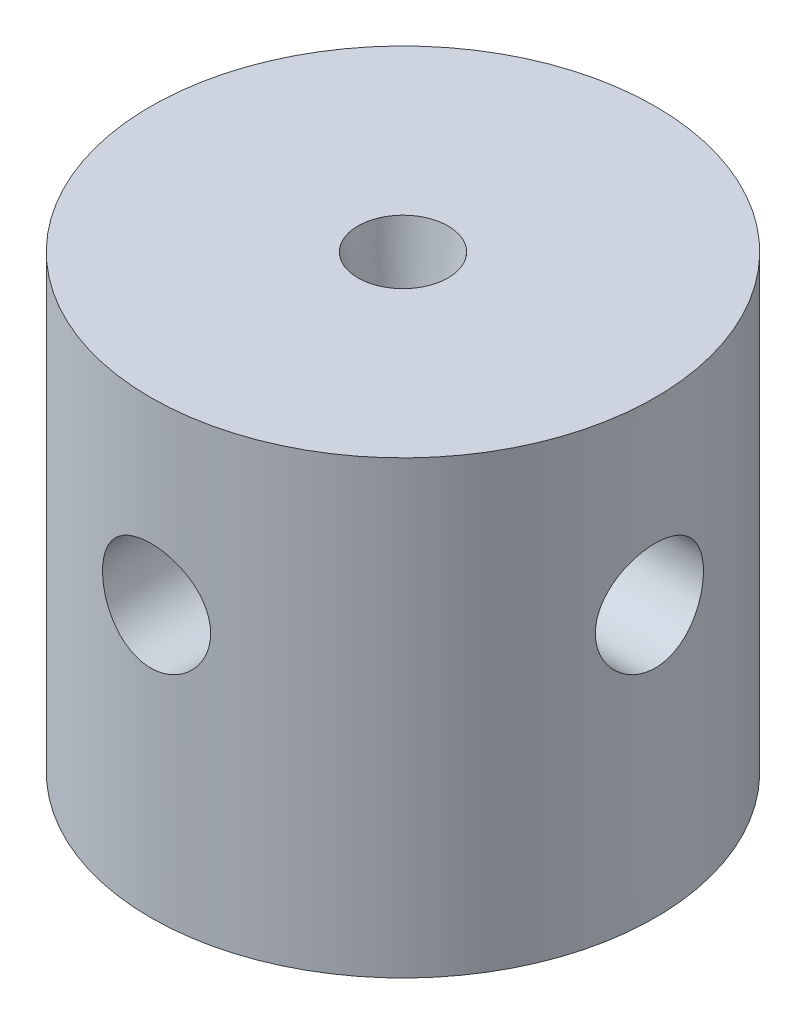
ISO-10303-21;
HEADER;
FILE_DESCRIPTION(('STEP AP214'),'2;1');
FILE_NAME('part.step','',(''),(''),'','','');
FILE_SCHEMA(('AUTOMOTIVE_DESIGN { 1 0 10303 214 1 1 1 1 }'));
ENDSEC;
DATA;
#1=APPLICATION_CONTEXT('core data for automotive mechanical design processes');
#2=APPLICATION_PROTOCOL_DEFINITION('international standard','automotive_design',2000,#1);
#3=PRODUCT_CONTEXT('',#1,'mechanical');
#4=PRODUCT('Part','Part','',(#3));
#5=PRODUCT_RELATED_PRODUCT_CATEGORY('part','',(#4));
#6=PRODUCT_DEFINITION_FORMATION('','',#4);
#7=PRODUCT_DEFINITION_CONTEXT('part definition',#1,'design');
#8=PRODUCT_DEFINITION('design','',#6,#7);
#9=PRODUCT_DEFINITION_SHAPE('','',#8);
#10=(LENGTH_UNIT() NAMED_UNIT(*) SI_UNIT(.MILLI.,.METRE.));
#11=(NAMED_UNIT(*) PLANE_ANGLE_UNIT() SI_UNIT($,.RADIAN.));
#12=(NAMED_UNIT(*) SI_UNIT($,.STERADIAN.) SOLID_ANGLE_UNIT());
#13=UNCERTAINTY_MEASURE_WITH_UNIT(LENGTH_MEASURE(1.E-05),#10,'distance_accuracy_value','');
#14=(GEOMETRIC_REPRESENTATION_CONTEXT(3) GLOBAL_UNCERTAINTY_ASSIGNED_CONTEXT((#13)) GLOBAL_UNIT_ASSIGNED_CONTEXT((#10,
#11,#12)) REPRESENTATION_CONTEXT('',''));
#15=CARTESIAN_POINT('',(0.,0.,0.));
#16=DIRECTION('',(0.,0.,1.));
#17=DIRECTION('',(1.,0.,0.));
#18=AXIS2_PLACEMENT_3D('',#15,#16,#17);
#19=CARTESIAN_POINT('',(0.,7.26763268611322,0.));
#20=DIRECTION('',(0.,1.,0.));
#21=DIRECTION('',(0.,0.,1.));
#22=AXIS2_PLACEMENT_3D('',#19,#20,#21);
#23=CONICAL_SURFACE('',#22,1.5,0.13962634015954);
#24=CARTESIAN_POINT('',(0.,14.3830024084978,0.));
#25=DIRECTION('',(0.,1.,0.));
#26=DIRECTION('',(0.,0.,1.));
#27=AXIS2_PLACEMENT_3D('',#24,#25,#26);
#28=CIRCLE('',#27,2.5);
#29=CARTESIAN_POINT('',(0.,14.3830024084978,2.5));
#30=VERTEX_POINT('',#29);
#31=EDGE_CURVE('E89',#30,#30,#28,.T.);
#32=ORIENTED_EDGE('',*,*,#31,.T.);
#33=EDGE_LOOP('',(#32));
#34=FACE_BOUND('',#33,.T.);
#35=CARTESIAN_POINT('',(0.,7.26763268611322,0.));
#36=DIRECTION('',(0.,1.,0.));
#37=DIRECTION('',(0.,0.,1.));
#38=AXIS2_PLACEMENT_3D('',#35,#36,#37);
#39=CIRCLE('',#38,1.5);
#40=CARTESIAN_POINT('',(0.,7.26763268611322,1.5));
#41=VERTEX_POINT('',#40);
#42=EDGE_CURVE('E101',#41,#41,#39,.T.);
#43=ORIENTED_EDGE('',*,*,#42,.F.);
#44=EDGE_LOOP('',(#43));
#45=FACE_BOUND('',#44,.T.);
#46=ADVANCED_FACE('F31',(#34,#45),#23,.F.);
#47=CARTESIAN_POINT('',(-2.5,14.3830024084978,0.));
#48=DIRECTION('',(0.,1.,0.));
#49=DIRECTION('',(0.,0.,1.));
#50=AXIS2_PLACEMENT_3D('',#47,#48,#49);
#51=PLANE('',#50);
#52=CARTESIAN_POINT('',(0.,14.3830024084978,0.));
#53=DIRECTION('',(0.,1.,0.));
#54=DIRECTION('',(0.,0.,1.));
#55=AXIS2_PLACEMENT_3D('',#52,#53,#54);
#56=CIRCLE('',#55,14.);
#57=CARTESIAN_POINT('',(0.,14.3830024084978,14.));
#58=VERTEX_POINT('',#57);
#59=EDGE_CURVE('E92',#58,#58,#56,.T.);
#60=ORIENTED_EDGE('',*,*,#59,.T.);
#61=EDGE_LOOP('',(#60));
#62=FACE_BOUND('',#61,.T.);
#63=ORIENTED_EDGE('',*,*,#31,.F.);
#64=EDGE_LOOP('',(#63));
#65=FACE_BOUND('',#64,.T.);
#66=ADVANCED_FACE('F129',(#62,#65),#51,.T.);
#67=CARTESIAN_POINT('',(0.,20.798274686081,0.));
#68=DIRECTION('',(0.,1.,0.));
#69=DIRECTION('',(0.,0.,1.));
#70=AXIS2_PLACEMENT_3D('',#67,#68,#69);
#71=CYLINDRICAL_SURFACE('',#70,14.);
#72=CARTESIAN_POINT('',(-3.00000000000005,4.38300240849778,-13.6747943311773));
#73=CARTESIAN_POINT('',(-2.99999416477358,4.54942471346381,-13.6747976912119));
#74=CARTESIAN_POINT('',(-2.98610472489575,4.71591795638259,-13.6778654468474));
#75=CARTESIAN_POINT('',(-2.9309711850597,5.04417575298122,-13.6897835685885));
#76=CARTESIAN_POINT('',(-2.88970679307239,5.20593670585004,-13.6986382242345));
#77=CARTESIAN_POINT('',(-2.78117727369212,5.51993390764634,-13.7210823058705));
#78=CARTESIAN_POINT('',(-2.71394001982636,5.67218016474076,-13.7346666545171));
#79=CARTESIAN_POINT('',(-2.55545235346684,5.96323295638696,-13.7650334169722));
#80=CARTESIAN_POINT('',(-2.46420264097556,6.10203988255592,-13.7818157375507));
#81=CARTESIAN_POINT('',(-2.25870285140447,6.36452833146204,-13.8169915759332));
#82=CARTESIAN_POINT('',(-2.14413718967971,6.48796016097771,-13.8354049974351));
#83=CARTESIAN_POINT('',(-1.8959390162592,6.71400951730935,-13.8715938342079));
#84=CARTESIAN_POINT('',(-1.7623050604354,6.81662546621792,-13.8893692010283));
#85=CARTESIAN_POINT('',(-1.47809457692921,6.99911329748065,-13.9224953821886));
#86=CARTESIAN_POINT('',(-1.32736097645995,7.07874572003902,-13.9378199763886));
#87=CARTESIAN_POINT('',(-1.01426853868524,7.21145779139036,-13.9640934208587));
#88=CARTESIAN_POINT('',(-0.851910954760672,7.26454029807034,-13.9750427420666));
#89=CARTESIAN_POINT('',(-0.522774375343072,7.34186235036046,-13.9911913056236));
#90=CARTESIAN_POINT('',(-0.356098801193895,7.36652426560264,-13.9964746675677));
#91=CARTESIAN_POINT('',(-0.0208978906133376,7.3876249631243,-14.00098724414));
#92=CARTESIAN_POINT('',(0.14762724032947,7.38406684961929,-14.000217124654));
#93=CARTESIAN_POINT('',(0.478834058500975,7.34914447917062,-13.9927740172512));
#94=CARTESIAN_POINT('',(0.641566230724176,7.31823540791794,-13.9861976630486));
#95=CARTESIAN_POINT('',(0.959478927956729,7.23021304479406,-13.9679908317821));
#96=CARTESIAN_POINT('',(1.11465912035006,7.1730985998983,-13.9563601323304));
#97=CARTESIAN_POINT('',(1.41433499511306,7.03387949072074,-13.9291950929372));
#98=CARTESIAN_POINT('',(1.55874731403153,6.95160087408909,-13.9136337160789));
#99=CARTESIAN_POINT('',(1.83188185312564,6.76451847217059,-13.8803158748773));
#100=CARTESIAN_POINT('',(1.96060201290301,6.65971173389718,-13.8625591228939));
#101=CARTESIAN_POINT('',(2.20140417600391,6.42806531944205,-13.8263865292185));
#102=CARTESIAN_POINT('',(2.31310234640496,6.30082724978371,-13.8079646074571));
#103=CARTESIAN_POINT('',(2.51364486469451,6.02923583836077,-13.7728713366395));
#104=CARTESIAN_POINT('',(2.60248864236132,5.88488206968729,-13.7562000312677));
#105=CARTESIAN_POINT('',(2.75496155146588,5.58255340637026,-13.7264804717345));
#106=CARTESIAN_POINT('',(2.81852070177841,5.4245421607929,-13.7134423025555));
#107=CARTESIAN_POINT('',(2.91806990318226,5.0997368766049,-13.6926068161323));
#108=CARTESIAN_POINT('',(2.95406413389251,4.9329441736114,-13.6848087043697));
#109=CARTESIAN_POINT('',(2.99687172049299,4.59881090319835,-13.6754976251089));
#110=CARTESIAN_POINT('',(3.00424283857276,4.43154505834317,-13.673864541034));
#111=CARTESIAN_POINT('',(2.99110279284742,4.09817442213439,-13.6767447914799));
#112=CARTESIAN_POINT('',(2.97059346163266,3.93206955519068,-13.6812577220213));
#113=CARTESIAN_POINT('',(2.90275789271164,3.60766153853626,-13.6958083096841));
#114=CARTESIAN_POINT('',(2.85573660503102,3.44929154330387,-13.7057831054873));
#115=CARTESIAN_POINT('',(2.73654105893494,3.14267773343194,-13.7300771973956));
#116=CARTESIAN_POINT('',(2.66436447325632,2.9944348572294,-13.744396895457));
#117=CARTESIAN_POINT('',(2.49567008833405,2.70986303897995,-13.7760326816069));
#118=CARTESIAN_POINT('',(2.3988073718158,2.57374324447341,-13.7933900349263));
#119=CARTESIAN_POINT('',(2.18394367667196,2.31948571675019,-13.8290355072028));
#120=CARTESIAN_POINT('',(2.06594018364317,2.20135012560085,-13.8473237366892));
#121=CARTESIAN_POINT('',(1.80962552884158,1.98426180260827,-13.8831647998035));
#122=CARTESIAN_POINT('',(1.67098985165749,1.88568857618376,-13.9006987121549));
#123=CARTESIAN_POINT('',(1.3788029625645,1.71323158979568,-13.932712214298));
#124=CARTESIAN_POINT('',(1.22525243208743,1.63934670255212,-13.9471919435339));
#125=CARTESIAN_POINT('',(0.908530837964032,1.51889829922083,-13.9713855676315));
#126=CARTESIAN_POINT('',(0.745426386150298,1.47216580100522,-13.9811288760739));
#127=CARTESIAN_POINT('',(0.413450354006528,1.40681899703315,-13.9948787860397));
#128=CARTESIAN_POINT('',(0.24457957994793,1.38820077654997,-13.9988861862461));
#129=CARTESIAN_POINT('',(-0.0905274341056987,1.37978110367405,-14.000690220181));
#130=CARTESIAN_POINT('',(-0.256749011018478,1.38941209128849,-13.9986091800327));
#131=CARTESIAN_POINT('',(-0.585145876831997,1.43595193553589,-13.9887310472683));
#132=CARTESIAN_POINT('',(-0.747321232810724,1.47286033965461,-13.9809340494761));
#133=CARTESIAN_POINT('',(-1.06260389697448,1.57264002099658,-13.9605077727683));
#134=CARTESIAN_POINT('',(-1.21573673014601,1.63543378726821,-13.9478929286009));
#135=CARTESIAN_POINT('',(-1.50936991344688,1.78512495083671,-13.9191807210221));
#136=CARTESIAN_POINT('',(-1.6498690895938,1.87202458511239,-13.9030830344402));
#137=CARTESIAN_POINT('',(-1.91702461378904,2.06932704598053,-13.8687961986559));
#138=CARTESIAN_POINT('',(-2.04338073020598,2.18013072513062,-13.8505741780296));
#139=CARTESIAN_POINT('',(-2.27590002915852,2.42128362900827,-13.8142738016446));
#140=CARTESIAN_POINT('',(-2.38205836126947,2.55163753524556,-13.7961954813912));
#141=CARTESIAN_POINT('',(-2.57246523191566,2.83018339483703,-13.761973872554));
#142=CARTESIAN_POINT('',(-2.65641795611849,2.97858112494323,-13.7458581173137));
#143=CARTESIAN_POINT('',(-2.79806009312276,3.28768985021461,-13.7177299427786));
#144=CARTESIAN_POINT('',(-2.85577212846065,3.44839009896963,-13.7057139912142));
#145=CARTESIAN_POINT('',(-2.93277214244346,3.73825467089013,-13.6894112131582));
#146=CARTESIAN_POINT('',(-2.95793505015823,3.865825759919,-13.683965661845));
#147=CARTESIAN_POINT('',(-2.99155088086548,4.12325103164685,-13.6766559900021));
#148=CARTESIAN_POINT('',(-3.00000455455868,4.25310511151276,-13.6747917085757));
#149=CARTESIAN_POINT('',(-3.00000000000005,4.38300240849778,-13.6747943311773));
#150=B_SPLINE_CURVE_WITH_KNOTS('',3,(#72,#73,#74,#75,#76,#77,#78,#79,#80,#81,#82,#83,#84,#85,
#86,#87,#88,#89,#90,#91,#92,#93,#94,#95,#96,#97,#98,#99,#100,#101,#102,#103,#104,#105,#106,#107,
#108,#109,#110,#111,#112,#113,#114,#115,#116,#117,#118,#119,#120,#121,#122,#123,#124,#125,#126,
#127,#128,#129,#130,#131,#132,#133,#134,#135,#136,#137,#138,#139,#140,#141,#142,#143,#144,#145,
#146,#147,#148,#149),.UNSPECIFIED.,.T.,.F.,(4,2,2,2,2,2,2,2,2,2,2,2,2,2,2,2,2,2,2,2,2,2,2,2,2,2,
2,2,2,2,2,2,2,2,2,2,2,2,4),(0.,0.498790964055055,0.997952076959928,1.49657898230552,
1.99519135347057,2.50106459165384,3.00697616225757,3.51798269640557,4.02893421292535,
4.53219016303857,5.03539075554482,5.53037115334743,6.02537333215167,6.52387776286874,
7.0224475774463,7.5309792155859,8.03952354046184,8.54946574823562,9.05933061907677,
9.55920866385045,10.0590538530783,10.5532636149875,11.047519111263,11.5491002043264,
12.0507409931816,12.5613242936642,13.0718842775108,13.5792317964875,14.0865086641708,
14.5836639928825,15.080811074302,15.5764801923897,16.0721953230273,16.5769782832193,
17.0818823126246,17.593207603363,18.1040912322742,18.4934291224859,18.8827495204009),.UNSPECIFIED.);
#151=CARTESIAN_POINT('',(-3.00000000000005,4.38300240849778,-13.6747943311773));
#152=VERTEX_POINT('',#151);
#153=EDGE_CURVE('E10',#152,#152,#150,.T.);
#154=ORIENTED_EDGE('',*,*,#153,.F.);
#155=EDGE_LOOP('',(#154));
#156=FACE_BOUND('',#155,.T.);
#157=CARTESIAN_POINT('',(-13.6747943311773,4.38300240849778,3.));
#158=CARTESIAN_POINT('',(-13.6747976912119,4.54942471346381,2.99999416477353));
#159=CARTESIAN_POINT('',(-13.6778654468474,4.71591795638259,2.9861047248957));
#160=CARTESIAN_POINT('',(-13.6897835685885,5.04417575298122,2.93097118505965));
#161=CARTESIAN_POINT('',(-13.6986382242345,5.20593670585004,2.88970679307235));
#162=CARTESIAN_POINT('',(-13.7210823058705,5.51993390764634,2.78117727369208));
#163=CARTESIAN_POINT('',(-13.7346666545171,5.67218016474076,2.71394001982631));
#164=CARTESIAN_POINT('',(-13.7650334169723,5.96323295638696,2.55545235346679));
#165=CARTESIAN_POINT('',(-13.7818157375507,6.10203988255592,2.46420264097551));
#166=CARTESIAN_POINT('',(-13.8169915759333,6.36452833146204,2.25870285140442));
#167=CARTESIAN_POINT('',(-13.8354049974351,6.48796016097771,2.14413718967966));
#168=CARTESIAN_POINT('',(-13.8715938342079,6.71400951730935,1.89593901625915));
#169=CARTESIAN_POINT('',(-13.8893692010283,6.81662546621792,1.76230506043535));
#170=CARTESIAN_POINT('',(-13.9224953821887,6.99911329748065,1.47809457692916));
#171=CARTESIAN_POINT('',(-13.9378199763886,7.07874572003902,1.32736097645991));
#172=CARTESIAN_POINT('',(-13.9640934208587,7.21145779139036,1.01426853868519));
#173=CARTESIAN_POINT('',(-13.9750427420666,7.26454029807034,0.851910954760624));
#174=CARTESIAN_POINT('',(-13.9911913056236,7.34186235036046,0.522774375343024));
#175=CARTESIAN_POINT('',(-13.9964746675677,7.36652426560264,0.356098801193847));
#176=CARTESIAN_POINT('',(-14.00098724414,7.3876249631243,0.0208978906132897));
#177=CARTESIAN_POINT('',(-14.000217124654,7.38406684961929,-0.147627240329518));
#178=CARTESIAN_POINT('',(-13.9927740172512,7.34914447917062,-0.478834058501023));
#179=CARTESIAN_POINT('',(-13.9861976630486,7.31823540791794,-0.641566230724225));
#180=CARTESIAN_POINT('',(-13.9679908317821,7.23021304479406,-0.959478927956778));
#181=CARTESIAN_POINT('',(-13.9563601323304,7.1730985998983,-1.11465912035011));
#182=CARTESIAN_POINT('',(-13.9291950929372,7.03387949072074,-1.41433499511311));
#183=CARTESIAN_POINT('',(-13.9136337160789,6.95160087408909,-1.55874731403158));
#184=CARTESIAN_POINT('',(-13.8803158748773,6.76451847217059,-1.83188185312569));
#185=CARTESIAN_POINT('',(-13.8625591228939,6.65971173389718,-1.96060201290306));
#186=CARTESIAN_POINT('',(-13.8263865292185,6.42806531944205,-2.20140417600396));
#187=CARTESIAN_POINT('',(-13.8079646074571,6.30082724978371,-2.31310234640501));
#188=CARTESIAN_POINT('',(-13.7728713366395,6.02923583836077,-2.51364486469456));
#189=CARTESIAN_POINT('',(-13.7562000312677,5.88488206968728,-2.60248864236137));
#190=CARTESIAN_POINT('',(-13.7264804717345,5.58255340637026,-2.75496155146593));
#191=CARTESIAN_POINT('',(-13.7134423025555,5.4245421607929,-2.81852070177845));
#192=CARTESIAN_POINT('',(-13.6926068161323,5.0997368766049,-2.91806990318231));
#193=CARTESIAN_POINT('',(-13.6848087043697,4.9329441736114,-2.95406413389256));
#194=CARTESIAN_POINT('',(-13.6754976251089,4.59881090319835,-2.99687172049304));
#195=CARTESIAN_POINT('',(-13.673864541034,4.43154505834317,-3.0042428385728));
#196=CARTESIAN_POINT('',(-13.6767447914799,4.09817442213439,-2.99110279284747));
#197=CARTESIAN_POINT('',(-13.6812577220213,3.93206955519068,-2.9705934616327));
#198=CARTESIAN_POINT('',(-13.6958083096841,3.60766153853626,-2.90275789271168));
#199=CARTESIAN_POINT('',(-13.7057831054873,3.44929154330387,-2.85573660503107));
#200=CARTESIAN_POINT('',(-13.7300771973955,3.14267773343194,-2.73654105893499));
#201=CARTESIAN_POINT('',(-13.744396895457,2.9944348572294,-2.66436447325637));
#202=CARTESIAN_POINT('',(-13.7760326816069,2.70986303897995,-2.4956700883341));
#203=CARTESIAN_POINT('',(-13.7933900349263,2.57374324447341,-2.39880737181584));
#204=CARTESIAN_POINT('',(-13.8290355072028,2.31948571675019,-2.18394367667201));
#205=CARTESIAN_POINT('',(-13.8473237366892,2.20135012560085,-2.06594018364322));
#206=CARTESIAN_POINT('',(-13.8831647998035,1.98426180260827,-1.80962552884163));
#207=CARTESIAN_POINT('',(-13.9006987121549,1.88568857618376,-1.67098985165754));
#208=CARTESIAN_POINT('',(-13.932712214298,1.71323158979568,-1.37880296256455));
#209=CARTESIAN_POINT('',(-13.9471919435339,1.63934670255212,-1.22525243208748));
#210=CARTESIAN_POINT('',(-13.9713855676315,1.51889829922083,-0.908530837964081));
#211=CARTESIAN_POINT('',(-13.9811288760739,1.47216580100522,-0.745426386150348));
#212=CARTESIAN_POINT('',(-13.9948787860397,1.40681899703315,-0.413450354006578));
#213=CARTESIAN_POINT('',(-13.9988861862461,1.38820077654997,-0.24457957994798));
#214=CARTESIAN_POINT('',(-14.000690220181,1.37978110367405,0.0905274341056491));
#215=CARTESIAN_POINT('',(-13.9986091800327,1.38941209128849,0.256749011018429));
#216=CARTESIAN_POINT('',(-13.9887310472683,1.43595193553589,0.585145876831948));
#217=CARTESIAN_POINT('',(-13.9809340494761,1.47286033965461,0.747321232810675));
#218=CARTESIAN_POINT('',(-13.9605077727683,1.57264002099658,1.06260389697443));
#219=CARTESIAN_POINT('',(-13.9478929286009,1.63543378726821,1.21573673014596));
#220=CARTESIAN_POINT('',(-13.9191807210222,1.78512495083671,1.50936991344683));
#221=CARTESIAN_POINT('',(-13.9030830344402,1.87202458511239,1.64986908959375));
#222=CARTESIAN_POINT('',(-13.8687961986559,2.06932704598053,1.91702461378899));
#223=CARTESIAN_POINT('',(-13.8505741780296,2.18013072513062,2.04338073020593));
#224=CARTESIAN_POINT('',(-13.8142738016446,2.42128362900827,2.27590002915847));
#225=CARTESIAN_POINT('',(-13.7961954813913,2.55163753524556,2.38205836126942));
#226=CARTESIAN_POINT('',(-13.761973872554,2.83018339483703,2.57246523191562));
#227=CARTESIAN_POINT('',(-13.7458581173137,2.97858112494323,2.65641795611844));
#228=CARTESIAN_POINT('',(-13.7177299427787,3.28768985021461,2.79806009312271));
#229=CARTESIAN_POINT('',(-13.7057139912142,3.44839009896963,2.8557721284606));
#230=CARTESIAN_POINT('',(-13.6894112131582,3.73825467089013,2.93277214244341));
#231=CARTESIAN_POINT('',(-13.683965661845,3.865825759919,2.95793505015818));
#232=CARTESIAN_POINT('',(-13.6766559900021,4.12325103164685,2.99155088086543));
#233=CARTESIAN_POINT('',(-13.6747917085757,4.25310511151276,3.00000455455863));
#234=CARTESIAN_POINT('',(-13.6747943311773,4.38300240849778,3.));
#235=B_SPLINE_CURVE_WITH_KNOTS('',3,(#157,#158,#159,#160,#161,#162,#163,#164,#165,#166,#167,
#168,#169,#170,#171,#172,#173,#174,#175,#176,#177,#178,#179,#180,#181,#182,#183,#184,#185,#186,
#187,#188,#189,#190,#191,#192,#193,#194,#195,#196,#197,#198,#199,#200,#201,#202,#203,#204,#205,
#206,#207,#208,#209,#210,#211,#212,#213,#214,#215,#216,#217,#218,#219,#220,#221,#222,#223,#224,
#225,#226,#227,#228,#229,#230,#231,#232,#233,#234),.UNSPECIFIED.,.T.,.F.,(4,2,2,2,2,2,2,2,2,2,2,
2,2,2,2,2,2,2,2,2,2,2,2,2,2,2,2,2,2,2,2,2,2,2,2,2,2,2,4),(0.,0.498790964055055,
0.997952076959928,1.49657898230552,1.99519135347057,2.50106459165384,3.00697616225757,
3.51798269640556,4.02893421292535,4.53219016303857,5.03539075554482,5.53037115334743,
6.02537333215167,6.52387776286874,7.0224475774463,7.5309792155859,8.03952354046184,
8.54946574823562,9.05933061907677,9.55920866385045,10.0590538530783,10.5532636149875,
11.047519111263,11.5491002043264,12.0507409931816,12.5613242936642,13.0718842775108,
13.5792317964875,14.0865086641708,14.5836639928825,15.080811074302,15.5764801923897,
16.0721953230273,16.5769782832193,17.0818823126246,17.593207603363,18.1040912322742,
18.4934291224859,18.8827495204009),.UNSPECIFIED.);
#236=CARTESIAN_POINT('',(-13.6747943311773,4.38300240849778,3.));
#237=VERTEX_POINT('',#236);
#238=EDGE_CURVE('E41',#237,#237,#235,.T.);
#239=ORIENTED_EDGE('',*,*,#238,.F.);
#240=EDGE_LOOP('',(#239));
#241=FACE_BOUND('',#240,.T.);
#242=CARTESIAN_POINT('',(0.,1.38300240849778,14.));
#243=CARTESIAN_POINT('',(0.166471772181233,1.38300820764638,13.9999969208645));
#244=CARTESIAN_POINT('',(0.333014391200549,1.39690562527348,13.9970005189942));
#245=CARTESIAN_POINT('',(0.661374688586657,1.45207372220493,13.9853365965546));
#246=CARTESIAN_POINT('',(0.823188807142384,1.49336449688761,13.976664912742));
#247=CARTESIAN_POINT('',(1.13729864763548,1.6019711377138,13.9546166357765));
#248=CARTESIAN_POINT('',(1.28960392689312,1.66926036726036,13.9412448593434));
#249=CARTESIAN_POINT('',(1.58075635592159,1.82787058084023,13.9112421363594));
#250=CARTESIAN_POINT('',(1.71960396349476,1.91919074699758,13.8946113007332));
#251=CARTESIAN_POINT('',(1.98204958107049,2.1247630078447,13.8596273849262));
#252=CARTESIAN_POINT('',(2.10541006838894,2.23931485229473,13.8412536628652));
#253=CARTESIAN_POINT('',(2.33132084778875,2.48745503986806,13.8050013962829));
#254=CARTESIAN_POINT('',(2.43386934301822,2.62104502500017,13.7871228946326));
#255=CARTESIAN_POINT('',(2.61628408759624,2.90521391421851,13.7536823209445));
#256=CARTESIAN_POINT('',(2.69589916670025,3.05595744401006,13.7381467268872));
#257=CARTESIAN_POINT('',(2.82857647382304,3.36907131603131,13.7114465111707));
#258=CARTESIAN_POINT('',(2.88164174003441,3.53144032548278,13.7002813894142));
#259=CARTESIAN_POINT('',(2.95893148844921,3.86062458167378,13.6837961785262));
#260=CARTESIAN_POINT('',(2.98357559496697,4.02733695982536,13.6783911379297));
#261=CARTESIAN_POINT('',(3.00462790413168,4.36261087351162,13.6737827969021));
#262=CARTESIAN_POINT('',(3.00103943329274,4.53117218885752,13.6745787658345));
#263=CARTESIAN_POINT('',(2.96606652681739,4.86225178436522,13.6822055320766));
#264=CARTESIAN_POINT('',(2.93516797298834,5.02482418669794,13.6889308336432));
#265=CARTESIAN_POINT('',(2.84722108597373,5.34242288907632,13.7074918675157));
#266=CARTESIAN_POINT('',(2.79017133872951,5.49744878056228,13.719327876168));
#267=CARTESIAN_POINT('',(2.65109102152004,5.79692815424433,13.7468816151144));
#268=CARTESIAN_POINT('',(2.56887221945682,5.94129143392276,13.7626284196673));
#269=CARTESIAN_POINT('',(2.3819201456801,6.21435273841358,13.7962114500257));
#270=CARTESIAN_POINT('',(2.27718392207149,6.34304870587007,13.8140479496379));
#271=CARTESIAN_POINT('',(2.04559085510666,6.58392111984447,13.8502543678775));
#272=CARTESIAN_POINT('',(1.91832046792908,6.69569982166716,13.8686276794435));
#273=CARTESIAN_POINT('',(1.64663461253847,6.89638987587702,13.9035003499412));
#274=CARTESIAN_POINT('',(1.50221885755108,6.98530084569848,13.9199996775194));
#275=CARTESIAN_POINT('',(1.19986692410021,7.13782376831158,13.94931557068));
#276=CARTESIAN_POINT('',(1.04190451772726,7.2013852336537,13.9621247728671));
#277=CARTESIAN_POINT('',(0.717206293371708,7.30095370513992,13.9825621849067));
#278=CARTESIAN_POINT('',(0.550471702267635,7.33696455362439,13.9901911172077));
#279=CARTESIAN_POINT('',(0.216375341673557,7.37983483678462,13.9993061269562));
#280=CARTESIAN_POINT('',(0.0490863545435281,7.38723783426134,14.0009067304213));
#281=CARTESIAN_POINT('',(-0.284337947300512,7.37415326624747,13.9981049787194));
#282=CARTESIAN_POINT('',(-0.450473336254215,7.35366751257192,13.993703013514));
#283=CARTESIAN_POINT('',(-0.77508507596532,7.28583792117442,13.9794628609053));
#284=CARTESIAN_POINT('',(-0.933623425816666,7.23877766955276,13.9696821009092));
#285=CARTESIAN_POINT('',(-1.24055690094655,7.1194485225082,13.9457784884302));
#286=CARTESIAN_POINT('',(-1.3889511851752,7.04717753987454,13.9316552764448));
#287=CARTESIAN_POINT('',(-1.67364279592924,6.87833532237721,13.900350087808));
#288=CARTESIAN_POINT('',(-1.80974515022202,6.78144281867842,13.8831286270855));
#289=CARTESIAN_POINT('',(-2.06395385104694,6.56653275872041,13.847620660697));
#290=CARTESIAN_POINT('',(-2.18205795738374,6.44851257672301,13.829334022842));
#291=CARTESIAN_POINT('',(-2.39905422115955,6.19220766812363,13.7933634541265));
#292=CARTESIAN_POINT('',(-2.4975707451029,6.0536022100537,13.7756958444257));
#293=CARTESIAN_POINT('',(-2.66992830772059,5.76149321554193,13.7433330911937));
#294=CARTESIAN_POINT('',(-2.74377039827391,5.60799031454294,13.7286378209611));
#295=CARTESIAN_POINT('',(-2.86419482497076,5.29125781050872,13.7040201961479));
#296=CARTESIAN_POINT('',(-2.91092797282532,5.1280876956366,13.6940714916594));
#297=CARTESIAN_POINT('',(-2.97625392170654,4.79597124083066,13.6800237341684));
#298=CARTESIAN_POINT('',(-2.994851015605,4.6270257860953,13.6759237887942));
#299=CARTESIAN_POINT('',(-3.00319999852067,4.29193772214745,13.6740923769631));
#300=CARTESIAN_POINT('',(-2.99354694516609,4.12581037853678,13.6762295303709));
#301=CARTESIAN_POINT('',(-2.9469957881265,3.79760792423276,13.6863352636966));
#302=CARTESIAN_POINT('',(-2.91009797915947,3.63553276972478,13.6943037805343));
#303=CARTESIAN_POINT('',(-2.81038691880858,3.32048509275959,13.7151116220832));
#304=CARTESIAN_POINT('',(-2.74765694341765,3.16748511116934,13.7279352844941));
#305=CARTESIAN_POINT('',(-2.59813503191194,2.87409166348421,13.757015291813));
#306=CARTESIAN_POINT('',(-2.51134070602993,2.73369945126782,13.7732719776073));
#307=CARTESIAN_POINT('',(-2.31416580698602,2.46656602104717,13.8077811118646));
#308=CARTESIAN_POINT('',(-2.20335974842469,2.34014301660394,13.8260661987785));
#309=CARTESIAN_POINT('',(-1.96217310923921,2.10748988345696,13.8623489959939));
#310=CARTESIAN_POINT('',(-1.83178801877117,2.00126441987347,13.8803466390259));
#311=CARTESIAN_POINT('',(-1.55320629453742,1.81077048948674,13.9142898209798));
#312=CARTESIAN_POINT('',(-1.40480969201927,1.7267891960359,13.9302072914125));
#313=CARTESIAN_POINT('',(-1.09570032188119,1.58509335068547,13.9579165220804));
#314=CARTESIAN_POINT('',(-0.93499821172776,1.52735636332776,13.9697118042469));
#315=CARTESIAN_POINT('',(-0.645070435106411,1.45029803823552,13.9856969692354));
#316=CARTESIAN_POINT('',(-0.517434411091962,1.42510954053775,13.9910278377653));
#317=CARTESIAN_POINT('',(-0.259879921707696,1.39145980507446,13.9981804830944));
#318=CARTESIAN_POINT('',(-0.129961550177492,1.38299788120567,14.0000024038263));
#319=CARTESIAN_POINT('',(0.,1.38300240849778,14.));
#320=B_SPLINE_CURVE_WITH_KNOTS('',3,(#242,#243,#244,#245,#246,#247,#248,#249,#250,#251,#252,
#253,#254,#255,#256,#257,#258,#259,#260,#261,#262,#263,#264,#265,#266,#267,#268,#269,#270,#271,
#272,#273,#274,#275,#276,#277,#278,#279,#280,#281,#282,#283,#284,#285,#286,#287,#288,#289,#290,
#291,#292,#293,#294,#295,#296,#297,#298,#299,#300,#301,#302,#303,#304,#305,#306,#307,#308,#309,
#310,#311,#312,#313,#314,#315,#316,#317,#318,#319),.UNSPECIFIED.,.T.,.F.,(4,2,2,2,2,2,2,2,2,2,2,
2,2,2,2,2,2,2,2,2,2,2,2,2,2,2,2,2,2,2,2,2,2,2,2,2,2,2,4),(0.,0.498939673024163,
0.998245766439869,1.4970416488512,1.99582055729177,2.50149923763463,3.00722155837012,
3.5182885842902,4.02929711354978,4.53266016249331,5.03596390338329,5.53048950905855,
6.02504185809136,6.52338712331935,7.02179775841778,7.53054022100581,8.03929119404699,
8.54905042279611,9.05873854512686,9.55869331408369,10.0586156046286,10.5533012117853,
11.0480277839687,11.549574677356,12.0511839460897,12.5616412656707,13.0720768215161,
13.5796448081695,14.0871353445837,14.5840136108059,15.0808865021654,15.5761699941357,
16.0715026890325,16.5764590030823,17.0815318079423,17.5928382071444,18.1037066802054,
18.4932359826459,18.8827493067467),.UNSPECIFIED.);
#321=CARTESIAN_POINT('',(0.,1.38300240849778,14.));
#322=VERTEX_POINT('',#321);
#323=EDGE_CURVE('E45',#322,#322,#320,.T.);
#324=ORIENTED_EDGE('',*,*,#323,.F.);
#325=EDGE_LOOP('',(#324));
#326=FACE_BOUND('',#325,.T.);
#327=CARTESIAN_POINT('',(13.6747943311773,4.38300240849778,-3.));
#328=CARTESIAN_POINT('',(13.6747976912119,4.54942471346381,-2.99999416477353));
#329=CARTESIAN_POINT('',(13.6778654468474,4.71591795638259,-2.9861047248957));
#330=CARTESIAN_POINT('',(13.6897835685885,5.04417575298122,-2.93097118505965));
#331=CARTESIAN_POINT('',(13.6986382242345,5.20593670585004,-2.88970679307235));
#332=CARTESIAN_POINT('',(13.7210823058705,5.51993390764634,-2.78117727369208));
#333=CARTESIAN_POINT('',(13.7346666545171,5.67218016474076,-2.71394001982631));
#334=CARTESIAN_POINT('',(13.7650334169723,5.96323295638696,-2.55545235346679));
#335=CARTESIAN_POINT('',(13.7818157375507,6.10203988255592,-2.46420264097551));
#336=CARTESIAN_POINT('',(13.8169915759333,6.36452833146204,-2.25870285140442));
#337=CARTESIAN_POINT('',(13.8354049974351,6.48796016097771,-2.14413718967966));
#338=CARTESIAN_POINT('',(13.8715938342079,6.71400951730935,-1.89593901625915));
#339=CARTESIAN_POINT('',(13.8893692010283,6.81662546621792,-1.76230506043535));
#340=CARTESIAN_POINT('',(13.9224953821887,6.99911329748065,-1.47809457692916));
#341=CARTESIAN_POINT('',(13.9378199763886,7.07874572003902,-1.32736097645991));
#342=CARTESIAN_POINT('',(13.9640934208587,7.21145779139036,-1.01426853868519));
#343=CARTESIAN_POINT('',(13.9750427420666,7.26454029807034,-0.851910954760624));
#344=CARTESIAN_POINT('',(13.9911913056236,7.34186235036046,-0.522774375343024));
#345=CARTESIAN_POINT('',(13.9964746675677,7.36652426560264,-0.356098801193847));
#346=CARTESIAN_POINT('',(14.00098724414,7.3876249631243,-0.0208978906132897));
#347=CARTESIAN_POINT('',(14.000217124654,7.38406684961929,0.147627240329518));
#348=CARTESIAN_POINT('',(13.9927740172512,7.34914447917062,0.478834058501023));
#349=CARTESIAN_POINT('',(13.9861976630486,7.31823540791794,0.641566230724225));
#350=CARTESIAN_POINT('',(13.9679908317821,7.23021304479406,0.959478927956778));
#351=CARTESIAN_POINT('',(13.9563601323304,7.1730985998983,1.11465912035011));
#352=CARTESIAN_POINT('',(13.9291950929372,7.03387949072074,1.41433499511311));
#353=CARTESIAN_POINT('',(13.9136337160789,6.95160087408909,1.55874731403158));
#354=CARTESIAN_POINT('',(13.8803158748773,6.76451847217059,1.83188185312569));
#355=CARTESIAN_POINT('',(13.8625591228939,6.65971173389718,1.96060201290306));
#356=CARTESIAN_POINT('',(13.8263865292185,6.42806531944205,2.20140417600396));
#357=CARTESIAN_POINT('',(13.8079646074571,6.30082724978371,2.31310234640501));
#358=CARTESIAN_POINT('',(13.7728713366395,6.02923583836077,2.51364486469456));
#359=CARTESIAN_POINT('',(13.7562000312677,5.88488206968728,2.60248864236137));
#360=CARTESIAN_POINT('',(13.7264804717345,5.58255340637026,2.75496155146593));
#361=CARTESIAN_POINT('',(13.7134423025555,5.4245421607929,2.81852070177845));
#362=CARTESIAN_POINT('',(13.6926068161323,5.0997368766049,2.91806990318231));
#363=CARTESIAN_POINT('',(13.6848087043697,4.9329441736114,2.95406413389256));
#364=CARTESIAN_POINT('',(13.6754976251089,4.59881090319835,2.99687172049304));
#365=CARTESIAN_POINT('',(13.673864541034,4.43154505834317,3.0042428385728));
#366=CARTESIAN_POINT('',(13.6767447914799,4.09817442213439,2.99110279284747));
#367=CARTESIAN_POINT('',(13.6812577220213,3.93206955519068,2.9705934616327));
#368=CARTESIAN_POINT('',(13.6958083096841,3.60766153853626,2.90275789271168));
#369=CARTESIAN_POINT('',(13.7057831054873,3.44929154330387,2.85573660503107));
#370=CARTESIAN_POINT('',(13.7300771973955,3.14267773343194,2.73654105893499));
#371=CARTESIAN_POINT('',(13.744396895457,2.9944348572294,2.66436447325637));
#372=CARTESIAN_POINT('',(13.7760326816069,2.70986303897995,2.4956700883341));
#373=CARTESIAN_POINT('',(13.7933900349263,2.57374324447341,2.39880737181584));
#374=CARTESIAN_POINT('',(13.8290355072028,2.31948571675019,2.18394367667201));
#375=CARTESIAN_POINT('',(13.8473237366892,2.20135012560085,2.06594018364322));
#376=CARTESIAN_POINT('',(13.8831647998035,1.98426180260827,1.80962552884163));
#377=CARTESIAN_POINT('',(13.9006987121549,1.88568857618376,1.67098985165754));
#378=CARTESIAN_POINT('',(13.932712214298,1.71323158979568,1.37880296256455));
#379=CARTESIAN_POINT('',(13.9471919435339,1.63934670255212,1.22525243208748));
#380=CARTESIAN_POINT('',(13.9713855676315,1.51889829922083,0.908530837964081));
#381=CARTESIAN_POINT('',(13.9811288760739,1.47216580100522,0.745426386150348));
#382=CARTESIAN_POINT('',(13.9948787860397,1.40681899703315,0.413450354006578));
#383=CARTESIAN_POINT('',(13.9988861862461,1.38820077654997,0.24457957994798));
#384=CARTESIAN_POINT('',(14.000690220181,1.37978110367405,-0.0905274341056491));
#385=CARTESIAN_POINT('',(13.9986091800327,1.38941209128849,-0.256749011018429));
#386=CARTESIAN_POINT('',(13.9887310472683,1.43595193553589,-0.585145876831948));
#387=CARTESIAN_POINT('',(13.9809340494761,1.47286033965461,-0.747321232810675));
#388=CARTESIAN_POINT('',(13.9605077727683,1.57264002099658,-1.06260389697443));
#389=CARTESIAN_POINT('',(13.9478929286009,1.63543378726821,-1.21573673014596));
#390=CARTESIAN_POINT('',(13.9191807210222,1.78512495083671,-1.50936991344683));
#391=CARTESIAN_POINT('',(13.9030830344402,1.87202458511239,-1.64986908959375));
#392=CARTESIAN_POINT('',(13.8687961986559,2.06932704598053,-1.91702461378899));
#393=CARTESIAN_POINT('',(13.8505741780296,2.18013072513062,-2.04338073020593));
#394=CARTESIAN_POINT('',(13.8142738016446,2.42128362900827,-2.27590002915847));
#395=CARTESIAN_POINT('',(13.7961954813913,2.55163753524556,-2.38205836126942));
#396=CARTESIAN_POINT('',(13.761973872554,2.83018339483703,-2.57246523191562));
#397=CARTESIAN_POINT('',(13.7458581173137,2.97858112494323,-2.65641795611844));
#398=CARTESIAN_POINT('',(13.7177299427787,3.28768985021461,-2.79806009312271));
#399=CARTESIAN_POINT('',(13.7057139912142,3.44839009896963,-2.8557721284606));
#400=CARTESIAN_POINT('',(13.6894112131582,3.73825467089013,-2.93277214244341));
#401=CARTESIAN_POINT('',(13.683965661845,3.865825759919,-2.95793505015818));
#402=CARTESIAN_POINT('',(13.6766559900021,4.12325103164685,-2.99155088086543));
#403=CARTESIAN_POINT('',(13.6747917085757,4.25310511151276,-3.00000455455863));
#404=CARTESIAN_POINT('',(13.6747943311773,4.38300240849778,-3.));
#405=B_SPLINE_CURVE_WITH_KNOTS('',3,(#327,#328,#329,#330,#331,#332,#333,#334,#335,#336,#337,
#338,#339,#340,#341,#342,#343,#344,#345,#346,#347,#348,#349,#350,#351,#352,#353,#354,#355,#356,
#357,#358,#359,#360,#361,#362,#363,#364,#365,#366,#367,#368,#369,#370,#371,#372,#373,#374,#375,
#376,#377,#378,#379,#380,#381,#382,#383,#384,#385,#386,#387,#388,#389,#390,#391,#392,#393,#394,
#395,#396,#397,#398,#399,#400,#401,#402,#403,#404),.UNSPECIFIED.,.T.,.F.,(4,2,2,2,2,2,2,2,2,2,2,
2,2,2,2,2,2,2,2,2,2,2,2,2,2,2,2,2,2,2,2,2,2,2,2,2,2,2,4),(0.,0.498790964055055,
0.997952076959928,1.49657898230552,1.99519135347057,2.50106459165384,3.00697616225757,
3.51798269640556,4.02893421292535,4.53219016303857,5.03539075554482,5.53037115334743,
6.02537333215167,6.52387776286874,7.0224475774463,7.5309792155859,8.03952354046184,
8.54946574823562,9.05933061907677,9.55920866385045,10.0590538530783,10.5532636149875,
11.047519111263,11.5491002043264,12.0507409931816,12.5613242936642,13.0718842775108,
13.5792317964875,14.0865086641708,14.5836639928825,15.080811074302,15.5764801923897,
16.0721953230273,16.5769782832193,17.0818823126246,17.593207603363,18.1040912322742,
18.4934291224859,18.8827495204009),.UNSPECIFIED.);
#406=CARTESIAN_POINT('',(13.6747943311773,4.38300240849778,-3.));
#407=VERTEX_POINT('',#406);
#408=EDGE_CURVE('E49',#407,#407,#405,.T.);
#409=ORIENTED_EDGE('',*,*,#408,.F.);
#410=EDGE_LOOP('',(#409));
#411=FACE_BOUND('',#410,.T.);
#412=CARTESIAN_POINT('',(0.,-10.6169975915022,0.));
#413=DIRECTION('',(0.,1.,0.));
#414=DIRECTION('',(0.,0.,1.));
#415=AXIS2_PLACEMENT_3D('',#412,#413,#414);
#416=CIRCLE('',#415,14.);
#417=CARTESIAN_POINT('',(0.,-10.6169975915022,-14.));
#418=VERTEX_POINT('',#417);
#419=EDGE_CURVE('E95',#418,#418,#416,.T.);
#420=ORIENTED_EDGE('',*,*,#419,.T.);
#421=EDGE_LOOP('',(#420));
#422=FACE_BOUND('',#421,.T.);
#423=ORIENTED_EDGE('',*,*,#59,.F.);
#424=EDGE_LOOP('',(#423));
#425=FACE_BOUND('',#424,.T.);
#426=ADVANCED_FACE('F58',(#156,#241,#326,#411,#422,#425),#71,.T.);
#427=CARTESIAN_POINT('',(0.,-10.6169975915022,0.));
#428=DIRECTION('',(0.,-1.,0.));
#429=DIRECTION('',(0.,0.,-1.));
#430=AXIS2_PLACEMENT_3D('',#427,#428,#429);
#431=CONICAL_SURFACE('',#430,14.,1.30899693899575);
#432=CARTESIAN_POINT('',(0.,-7.26763268611322,0.));
#433=DIRECTION('',(0.,1.,0.));
#434=DIRECTION('',(0.,0.,1.));
#435=AXIS2_PLACEMENT_3D('',#432,#433,#434);
#436=CIRCLE('',#435,1.5);
#437=CARTESIAN_POINT('',(0.,-7.26763268611322,-1.5));
#438=VERTEX_POINT('',#437);
#439=EDGE_CURVE('E98',#438,#438,#436,.T.);
#440=CARTESIAN_POINT('',(0.,-7.26763268611322,-1.5));
#441=CARTESIAN_POINT('',(0.,-7.30252190387769,-1.63020833333334));
#442=CARTESIAN_POINT('',(0.,-7.33741112164216,-1.76041666666667));
#443=CARTESIAN_POINT('',(0.,-7.4071895571711,-2.02083333333334));
#444=CARTESIAN_POINT('',(0.,-7.44207877493557,-2.15104166666667));
#445=CARTESIAN_POINT('',(0.,-7.5118572104645,-2.41145833333334));
#446=CARTESIAN_POINT('',(0.,-7.54674642822897,-2.54166666666667));
#447=CARTESIAN_POINT('',(0.,-7.61652486375791,-2.80208333333334));
#448=CARTESIAN_POINT('',(0.,-7.65141408152238,-2.93229166666667));
#449=CARTESIAN_POINT('',(0.,-7.72119251705132,-3.19270833333334));
#450=CARTESIAN_POINT('',(0.,-7.75608173481579,-3.32291666666667));
#451=CARTESIAN_POINT('',(0.,-7.82586017034472,-3.58333333333334));
#452=CARTESIAN_POINT('',(0.,-7.86074938810919,-3.71354166666667));
#453=CARTESIAN_POINT('',(0.,-7.93052782363813,-3.97395833333334));
#454=CARTESIAN_POINT('',(0.,-7.9654170414026,-4.10416666666667));
#455=CARTESIAN_POINT('',(0.,-8.03519547693153,-4.36458333333334));
#456=CARTESIAN_POINT('',(0.,-8.070084694696,-4.49479166666667));
#457=CARTESIAN_POINT('',(0.,-8.13986313022494,-4.75520833333334));
#458=CARTESIAN_POINT('',(0.,-8.17475234798941,-4.88541666666667));
#459=CARTESIAN_POINT('',(0.,-8.24453078351835,-5.14583333333334));
#460=CARTESIAN_POINT('',(0.,-8.27942000128282,-5.27604166666667));
#461=CARTESIAN_POINT('',(0.,-8.34919843681175,-5.53645833333334));
#462=CARTESIAN_POINT('',(0.,-8.38408765457622,-5.66666666666667));
#463=CARTESIAN_POINT('',(0.,-8.45386609010516,-5.92708333333334));
#464=CARTESIAN_POINT('',(0.,-8.48875530786963,-6.05729166666667));
#465=CARTESIAN_POINT('',(0.,-8.55853374339857,-6.31770833333334));
#466=CARTESIAN_POINT('',(0.,-8.59342296116303,-6.44791666666667));
#467=CARTESIAN_POINT('',(0.,-8.66320139669197,-6.70833333333334));
#468=CARTESIAN_POINT('',(0.,-8.69809061445644,-6.83854166666667));
#469=CARTESIAN_POINT('',(0.,-8.76786904998538,-7.09895833333334));
#470=CARTESIAN_POINT('',(0.,-8.80275826774985,-7.22916666666667));
#471=CARTESIAN_POINT('',(0.,-8.87253670327878,-7.48958333333334));
#472=CARTESIAN_POINT('',(0.,-8.90742592104325,-7.61979166666667));
#473=CARTESIAN_POINT('',(0.,-8.97720435657219,-7.88020833333334));
#474=CARTESIAN_POINT('',(0.,-9.01209357433666,-8.01041666666667));
#475=CARTESIAN_POINT('',(0.,-9.0818720098656,-8.27083333333334));
#476=CARTESIAN_POINT('',(0.,-9.11676122763006,-8.40104166666667));
#477=CARTESIAN_POINT('',(0.,-9.186539663159,-8.66145833333334));
#478=CARTESIAN_POINT('',(0.,-9.22142888092347,-8.79166666666667));
#479=CARTESIAN_POINT('',(0.,-9.29120731645241,-9.05208333333334));
#480=CARTESIAN_POINT('',(0.,-9.32609653421688,-9.18229166666667));
#481=CARTESIAN_POINT('',(0.,-9.39587496974582,-9.44270833333334));
#482=CARTESIAN_POINT('',(0.,-9.43076418751028,-9.57291666666667));
#483=CARTESIAN_POINT('',(0.,-9.50054262303922,-9.83333333333334));
#484=CARTESIAN_POINT('',(0.,-9.53543184080369,-9.96354166666667));
#485=CARTESIAN_POINT('',(0.,-9.60521027633263,-10.2239583333333));
#486=CARTESIAN_POINT('',(0.,-9.64009949409709,-10.3541666666667));
#487=CARTESIAN_POINT('',(0.,-9.70987792962604,-10.6145833333333));
#488=CARTESIAN_POINT('',(0.,-9.7447671473905,-10.7447916666667));
#489=CARTESIAN_POINT('',(0.,-9.81454558291944,-11.0052083333333));
#490=CARTESIAN_POINT('',(0.,-9.84943480068391,-11.1354166666667));
#491=CARTESIAN_POINT('',(0.,-9.91921323621285,-11.3958333333333));
#492=CARTESIAN_POINT('',(0.,-9.95410245397732,-11.5260416666667));
#493=CARTESIAN_POINT('',(0.,-10.0238808895063,-11.7864583333333));
#494=CARTESIAN_POINT('',(0.,-10.0587701072707,-11.9166666666667));
#495=CARTESIAN_POINT('',(0.,-10.1285485427997,-12.1770833333333));
#496=CARTESIAN_POINT('',(0.,-10.1634377605641,-12.3072916666667));
#497=CARTESIAN_POINT('',(0.,-10.2332161960931,-12.5677083333333));
#498=CARTESIAN_POINT('',(0.,-10.2681054138575,-12.6979166666667));
#499=CARTESIAN_POINT('',(0.,-10.3378838493865,-12.9583333333333));
#500=CARTESIAN_POINT('',(0.,-10.3727730671509,-13.0885416666667));
#501=CARTESIAN_POINT('',(0.,-10.4425515026799,-13.3489583333333));
#502=CARTESIAN_POINT('',(0.,-10.4774407204443,-13.4791666666667));
#503=CARTESIAN_POINT('',(0.,-10.5472191559733,-13.7395833333333));
#504=CARTESIAN_POINT('',(0.,-10.5821083737378,-13.8697916666667));
#505=CARTESIAN_POINT('',(0.,-10.6169975915022,-14.));
#506=B_SPLINE_CURVE_WITH_KNOTS('',3,(#440,#441,#442,#443,#444,#445,#446,#447,#448,#449,#450,
#451,#452,#453,#454,#455,#456,#457,#458,#459,#460,#461,#462,#463,#464,#465,#466,#467,#468,#469,
#470,#471,#472,#473,#474,#475,#476,#477,#478,#479,#480,#481,#482,#483,#484,#485,#486,#487,#488,
#489,#490,#491,#492,#493,#494,#495,#496,#497,#498,#499,#500,#501,#502,#503,#504,#505),
.UNSPECIFIED.,.F.,.F.,(4,2,2,2,2,2,2,2,2,2,2,2,2,2,2,2,2,2,2,2,2,2,2,2,2,2,2,2,2,2,2,2,4),(0.,
0.40440475797269,0.808809515945377,1.21321427391807,1.61761903189076,2.02202378986344,
2.42642854783613,2.83083330580882,3.23523806378151,3.6396428217542,4.04404757972689,
4.44845233769957,4.85285709567226,5.25726185364495,5.66166661161764,6.06607136959033,
6.47047612756302,6.87488088553571,7.2792856435084,7.68369040148108,8.08809515945377,
8.49249991742646,8.89690467539915,9.30130943337184,9.70571419134453,10.1101189493172,
10.5145237072899,10.9189284652626,11.3233332232353,11.727737981208,12.1321427391807,
12.5365474971533,12.940952255126),.UNSPECIFIED.);
#507=EDGE_CURVE('BSEAM141',#438,#418,#506,.T.);
#508=ORIENTED_EDGE('',*,*,#439,.T.);
#509=ORIENTED_EDGE('',*,*,#419,.F.);
#510=ORIENTED_EDGE('',*,*,#507,.T.);
#511=ORIENTED_EDGE('',*,*,#507,.F.);
#512=EDGE_LOOP('',(#508,#510,#509,#511));
#513=FACE_BOUND('',#512,.T.);
#514=ADVANCED_FACE('F141',(#513),#431,.F.);
#515=CARTESIAN_POINT('',(0.,20.798274686081,0.));
#516=DIRECTION('',(0.,1.,0.));
#517=DIRECTION('',(0.,0.,1.));
#518=AXIS2_PLACEMENT_3D('',#515,#516,#517);
#519=CYLINDRICAL_SURFACE('',#518,1.5);
#520=ORIENTED_EDGE('',*,*,#42,.T.);
#521=EDGE_LOOP('',(#520));
#522=FACE_BOUND('',#521,.T.);
#523=ORIENTED_EDGE('',*,*,#439,.F.);
#524=EDGE_LOOP('',(#523));
#525=FACE_BOUND('',#524,.T.);
#526=ADVANCED_FACE('F83',(#522,#525),#519,.F.);
#527=CARTESIAN_POINT('',(9.00000000000001,4.38300240849778,0.));
#528=DIRECTION('',(1.,0.,0.));
#529=DIRECTION('',(0.,0.,-1.));
#530=AXIS2_PLACEMENT_3D('',#527,#528,#529);
#531=CYLINDRICAL_SURFACE('',#530,3.);
#532=ORIENTED_EDGE('',*,*,#408,.T.);
#533=EDGE_LOOP('',(#532));
#534=FACE_BOUND('',#533,.T.);
#535=CARTESIAN_POINT('',(9.00000000000001,4.38300240849778,0.));
#536=DIRECTION('',(1.,0.,0.));
#537=DIRECTION('',(0.,0.,-1.));
#538=AXIS2_PLACEMENT_3D('',#535,#536,#537);
#539=CIRCLE('',#538,3.);
#540=CARTESIAN_POINT('',(9.00000000000001,4.38300240849778,-3.));
#541=VERTEX_POINT('',#540);
#542=EDGE_CURVE('E104',#541,#541,#539,.T.);
#543=ORIENTED_EDGE('',*,*,#542,.F.);
#544=EDGE_LOOP('',(#543));
#545=FACE_BOUND('',#544,.T.);
#546=ADVANCED_FACE('F78',(#534,#545),#531,.F.);
#547=CARTESIAN_POINT('',(9.00000000000001,4.38300240849778,0.));
#548=DIRECTION('',(1.,0.,0.));
#549=DIRECTION('',(0.,0.,-1.));
#550=AXIS2_PLACEMENT_3D('',#547,#548,#549);
#551=PLANE('',#550);
#552=ORIENTED_EDGE('',*,*,#542,.T.);
#553=EDGE_LOOP('',(#552));
#554=FACE_BOUND('',#553,.T.);
#555=ADVANCED_FACE('F74',(#554),#551,.T.);
#556=CARTESIAN_POINT('',(0.,4.38300240849778,9.00000000000001));
#557=DIRECTION('',(0.,0.,1.));
#558=DIRECTION('',(1.,0.,0.));
#559=AXIS2_PLACEMENT_3D('',#556,#557,#558);
#560=CYLINDRICAL_SURFACE('',#559,3.);
#561=ORIENTED_EDGE('',*,*,#323,.T.);
#562=EDGE_LOOP('',(#561));
#563=FACE_BOUND('',#562,.T.);
#564=CARTESIAN_POINT('',(0.,4.38300240849778,9.00000000000001));
#565=DIRECTION('',(0.,0.,1.));
#566=DIRECTION('',(1.,0.,0.));
#567=AXIS2_PLACEMENT_3D('',#564,#565,#566);
#568=CIRCLE('',#567,3.);
#569=CARTESIAN_POINT('',(3.00000000000009,4.38300240849778,8.99999999999997));
#570=VERTEX_POINT('',#569);
#571=EDGE_CURVE('E108',#570,#570,#568,.T.);
#572=ORIENTED_EDGE('',*,*,#571,.F.);
#573=EDGE_LOOP('',(#572));
#574=FACE_BOUND('',#573,.T.);
#575=ADVANCED_FACE('F69',(#563,#574),#560,.F.);
#576=CARTESIAN_POINT('',(0.,4.38300240849778,9.00000000000001));
#577=DIRECTION('',(0.,0.,1.));
#578=DIRECTION('',(1.,0.,0.));
#579=AXIS2_PLACEMENT_3D('',#576,#577,#578);
#580=PLANE('',#579);
#581=ORIENTED_EDGE('',*,*,#571,.T.);
#582=EDGE_LOOP('',(#581));
#583=FACE_BOUND('',#582,.T.);
#584=ADVANCED_FACE('F67',(#583),#580,.T.);
#585=CARTESIAN_POINT('',(-9.00000000000001,4.38300240849778,0.));
#586=DIRECTION('',(-1.,0.,0.));
#587=DIRECTION('',(0.,0.,1.));
#588=AXIS2_PLACEMENT_3D('',#585,#586,#587);
#589=CYLINDRICAL_SURFACE('',#588,3.);
#590=ORIENTED_EDGE('',*,*,#238,.T.);
#591=EDGE_LOOP('',(#590));
#592=FACE_BOUND('',#591,.T.);
#593=CARTESIAN_POINT('',(-9.00000000000001,4.38300240849778,0.));
#594=DIRECTION('',(-1.,0.,0.));
#595=DIRECTION('',(0.,0.,1.));
#596=AXIS2_PLACEMENT_3D('',#593,#594,#595);
#597=CIRCLE('',#596,3.);
#598=CARTESIAN_POINT('',(-9.00000000000001,4.38300240849778,3.));
#599=VERTEX_POINT('',#598);
#600=EDGE_CURVE('E111',#599,#599,#597,.T.);
#601=ORIENTED_EDGE('',*,*,#600,.F.);
#602=EDGE_LOOP('',(#601));
#603=FACE_BOUND('',#602,.T.);
#604=ADVANCED_FACE('F61',(#592,#603),#589,.F.);
#605=CARTESIAN_POINT('',(-9.00000000000001,4.38300240849778,0.));
#606=DIRECTION('',(-1.,0.,0.));
#607=DIRECTION('',(0.,0.,1.));
#608=AXIS2_PLACEMENT_3D('',#605,#606,#607);
#609=PLANE('',#608);
#610=ORIENTED_EDGE('',*,*,#600,.T.);
#611=EDGE_LOOP('',(#610));
#612=FACE_BOUND('',#611,.T.);
#613=ADVANCED_FACE('F66',(#612),#609,.T.);
#614=CARTESIAN_POINT('',(0.,4.38300240849778,-9.00000000000001));
#615=DIRECTION('',(0.,0.,-1.));
#616=DIRECTION('',(-1.,0.,0.));
#617=AXIS2_PLACEMENT_3D('',#614,#615,#616);
#618=CYLINDRICAL_SURFACE('',#617,3.);
#619=ORIENTED_EDGE('',*,*,#153,.T.);
#620=EDGE_LOOP('',(#619));
#621=FACE_BOUND('',#620,.T.);
#622=CARTESIAN_POINT('',(0.,4.38300240849778,-9.00000000000001));
#623=DIRECTION('',(0.,0.,-1.));
#624=DIRECTION('',(-1.,0.,0.));
#625=AXIS2_PLACEMENT_3D('',#622,#623,#624);
#626=CIRCLE('',#625,3.);
#627=CARTESIAN_POINT('',(-3.00000000000003,4.38300240849778,-8.99999999999999));
#628=VERTEX_POINT('',#627);
#629=EDGE_CURVE('E107',#628,#628,#626,.T.);
#630=ORIENTED_EDGE('',*,*,#629,.F.);
#631=EDGE_LOOP('',(#630));
#632=FACE_BOUND('',#631,.T.);
#633=ADVANCED_FACE('F119',(#621,#632),#618,.F.);
#634=CARTESIAN_POINT('',(0.,4.38300240849778,-9.00000000000001));
#635=DIRECTION('',(0.,0.,-1.));
#636=DIRECTION('',(-1.,0.,0.));
#637=AXIS2_PLACEMENT_3D('',#634,#635,#636);
#638=PLANE('',#637);
#639=ORIENTED_EDGE('',*,*,#629,.T.);
#640=EDGE_LOOP('',(#639));
#641=FACE_BOUND('',#640,.T.);
#642=ADVANCED_FACE('F117',(#641),#638,.T.);
#643=CLOSED_SHELL('',(#46,#66,#426,#514,#526,#546,#555,#575,#584,#604,#613,#633,#642));
#644=MANIFOLD_SOLID_BREP('B2',#643);
#645=ADVANCED_BREP_SHAPE_REPRESENTATION('',(#18,#644),#14);
#646=SHAPE_DEFINITION_REPRESENTATION(#9,#645);
ENDSEC;
END-ISO-10303-21;
